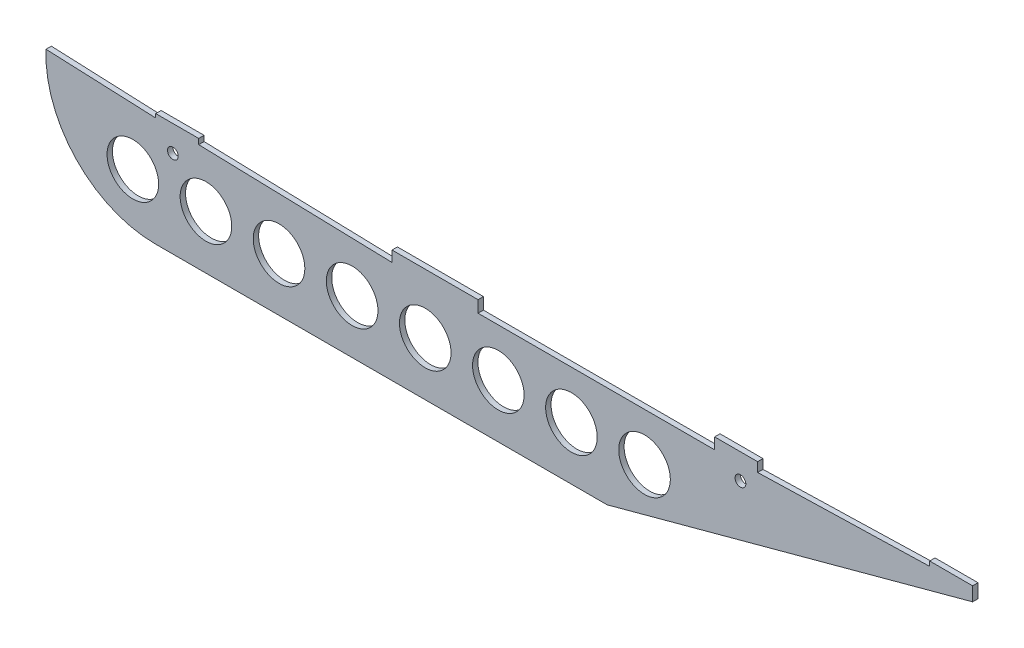
ISO-10303-21;
HEADER;
FILE_DESCRIPTION(('STEP AP214'),'2;1');
FILE_NAME('part.step','',(''),(''),'','','');
FILE_SCHEMA(('AUTOMOTIVE_DESIGN { 1 0 10303 214 1 1 1 1 }'));
ENDSEC;
DATA;
#1=APPLICATION_CONTEXT('core data for automotive mechanical design processes');
#2=APPLICATION_PROTOCOL_DEFINITION('international standard','automotive_design',2000,#1);
#3=PRODUCT_CONTEXT('',#1,'mechanical');
#4=PRODUCT('Part','Part','',(#3));
#5=PRODUCT_RELATED_PRODUCT_CATEGORY('part','',(#4));
#6=PRODUCT_DEFINITION_FORMATION('','',#4);
#7=PRODUCT_DEFINITION_CONTEXT('part definition',#1,'design');
#8=PRODUCT_DEFINITION('design','',#6,#7);
#9=PRODUCT_DEFINITION_SHAPE('','',#8);
#10=(LENGTH_UNIT() NAMED_UNIT(*) SI_UNIT(.MILLI.,.METRE.));
#11=(NAMED_UNIT(*) PLANE_ANGLE_UNIT() SI_UNIT($,.RADIAN.));
#12=(NAMED_UNIT(*) SI_UNIT($,.STERADIAN.) SOLID_ANGLE_UNIT());
#13=UNCERTAINTY_MEASURE_WITH_UNIT(LENGTH_MEASURE(1.E-05),#10,'distance_accuracy_value','');
#14=(GEOMETRIC_REPRESENTATION_CONTEXT(3) GLOBAL_UNCERTAINTY_ASSIGNED_CONTEXT((#13)) GLOBAL_UNIT_ASSIGNED_CONTEXT((#10,
#11,#12)) REPRESENTATION_CONTEXT('',''));
#15=CARTESIAN_POINT('',(0.,0.,0.));
#16=DIRECTION('',(0.,0.,1.));
#17=DIRECTION('',(1.,0.,0.));
#18=AXIS2_PLACEMENT_3D('',#15,#16,#17);
#19=CARTESIAN_POINT('',(64.5101689248782,-2.758684602,-1.5875));
#20=DIRECTION('',(0.,0.,1.));
#21=DIRECTION('',(1.,0.,0.));
#22=AXIS2_PLACEMENT_3D('',#19,#20,#21);
#23=PLANE('',#22);
#24=CARTESIAN_POINT('',(267.202840923619,-35.7108845805905,-1.5875));
#25=DIRECTION('',(0.,0.,1.));
#26=DIRECTION('',(1.,0.,0.));
#27=AXIS2_PLACEMENT_3D('',#24,#25,#26);
#28=CIRCLE('',#27,15.24);
#29=CARTESIAN_POINT('',(282.442840923619,-35.7108845805905,-1.5875));
#30=VERTEX_POINT('',#29);
#31=EDGE_CURVE('E366',#30,#30,#28,.F.);
#32=ORIENTED_EDGE('',*,*,#31,.F.);
#33=EDGE_LOOP('',(#32));
#34=FACE_BOUND('',#33,.T.);
#35=CARTESIAN_POINT('',(180.842840923619,-35.7108845805905,-1.5875));
#36=DIRECTION('',(0.,0.,1.));
#37=DIRECTION('',(1.,0.,0.));
#38=AXIS2_PLACEMENT_3D('',#35,#36,#37);
#39=CIRCLE('',#38,15.24);
#40=CARTESIAN_POINT('',(196.082840923619,-35.7108845805905,-1.5875));
#41=VERTEX_POINT('',#40);
#42=EDGE_CURVE('E358',#41,#41,#39,.F.);
#43=ORIENTED_EDGE('',*,*,#42,.F.);
#44=EDGE_LOOP('',(#43));
#45=FACE_BOUND('',#44,.T.);
#46=CARTESIAN_POINT('',(51.3028409236194,-35.7108845805905,-1.5875));
#47=DIRECTION('',(0.,0.,1.));
#48=DIRECTION('',(1.,0.,0.));
#49=AXIS2_PLACEMENT_3D('',#46,#47,#48);
#50=CIRCLE('',#49,15.24);
#51=CARTESIAN_POINT('',(66.5428409236194,-35.7108845805905,-1.5875));
#52=VERTEX_POINT('',#51);
#53=EDGE_CURVE('E350',#52,#52,#50,.F.);
#54=ORIENTED_EDGE('',*,*,#53,.F.);
#55=EDGE_LOOP('',(#54));
#56=FACE_BOUND('',#55,.T.);
#57=CARTESIAN_POINT('',(94.4828409236194,-35.7108845805905,-1.5875));
#58=DIRECTION('',(0.,0.,1.));
#59=DIRECTION('',(1.,0.,0.));
#60=AXIS2_PLACEMENT_3D('',#57,#58,#59);
#61=CIRCLE('',#60,15.24);
#62=CARTESIAN_POINT('',(109.722840923619,-35.7108845805905,-1.5875));
#63=VERTEX_POINT('',#62);
#64=EDGE_CURVE('E345',#63,#63,#61,.F.);
#65=ORIENTED_EDGE('',*,*,#64,.F.);
#66=EDGE_LOOP('',(#65));
#67=FACE_BOUND('',#66,.T.);
#68=CARTESIAN_POINT('',(410.219240225869,-15.743629592313,-1.5875));
#69=DIRECTION('',(0.,0.,1.));
#70=DIRECTION('',(1.,0.,0.));
#71=AXIS2_PLACEMENT_3D('',#68,#69,#70);
#72=CIRCLE('',#71,3.17499999999997);
#73=CARTESIAN_POINT('',(413.394240225869,-15.743629592313,-1.5875));
#74=VERTEX_POINT('',#73);
#75=EDGE_CURVE('E209',#74,#74,#72,.T.);
#76=ORIENTED_EDGE('',*,*,#75,.T.);
#77=EDGE_LOOP('',(#76));
#78=FACE_BOUND('',#77,.T.);
#79=DIRECTION('',(0.,-1.,0.));
#80=VECTOR('',#79,1.);
#81=CARTESIAN_POINT('',(204.414080589869,-0.503629592313006,-1.5875));
#82=LINE('',#81,#80);
#83=CARTESIAN_POINT('',(204.414080589869,-0.503629592313006,-1.5875));
#84=VERTEX_POINT('',#83);
#85=CARTESIAN_POINT('',(204.414080589869,-6.87581217431301,-1.5875));
#86=VERTEX_POINT('',#85);
#87=EDGE_CURVE('E186',#84,#86,#82,.T.);
#88=ORIENTED_EDGE('',*,*,#87,.F.);
#89=DIRECTION('',(-1.,0.,0.));
#90=VECTOR('',#89,1.);
#91=CARTESIAN_POINT('',(255.214080589869,-0.503629592313006,-1.5875));
#92=LINE('',#91,#90);
#93=CARTESIAN_POINT('',(255.214080589869,-0.503629592313006,-1.5875));
#94=VERTEX_POINT('',#93);
#95=EDGE_CURVE('E191',#94,#84,#92,.T.);
#96=ORIENTED_EDGE('',*,*,#95,.F.);
#97=DIRECTION('',(0.,1.,0.));
#98=VECTOR('',#97,1.);
#99=CARTESIAN_POINT('',(255.214080589869,-7.43290250031301,-1.5875));
#100=LINE('',#99,#98);
#101=CARTESIAN_POINT('',(255.214080589869,-7.43290250031301,-1.5875));
#102=VERTEX_POINT('',#101);
#103=EDGE_CURVE('E307',#102,#94,#100,.T.);
#104=ORIENTED_EDGE('',*,*,#103,.F.);
#105=DIRECTION('',(-1.,0.,0.));
#106=VECTOR('',#105,1.);
#107=CARTESIAN_POINT('',(394.979240225869,-7.432902500313,-1.5875));
#108=LINE('',#107,#106);
#109=CARTESIAN_POINT('',(394.979240225869,-7.432902500313,-1.5875));
#110=VERTEX_POINT('',#109);
#111=EDGE_CURVE('E304',#110,#102,#108,.T.);
#112=ORIENTED_EDGE('',*,*,#111,.F.);
#113=DIRECTION('',(0.,-1.,0.));
#114=VECTOR('',#113,1.);
#115=CARTESIAN_POINT('',(394.979240225869,-0.803587590313005,-1.5875));
#116=LINE('',#115,#114);
#117=CARTESIAN_POINT('',(394.979240225869,-0.803587590313005,-1.5875));
#118=VERTEX_POINT('',#117);
#119=EDGE_CURVE('E301',#118,#110,#116,.T.);
#120=ORIENTED_EDGE('',*,*,#119,.F.);
#121=DIRECTION('',(-1.,0.,0.));
#122=VECTOR('',#121,1.);
#123=CARTESIAN_POINT('',(420.379240225869,-0.803587590313005,-1.5875));
#124=LINE('',#123,#122);
#125=CARTESIAN_POINT('',(420.379240225869,-0.803587590313005,-1.5875));
#126=VERTEX_POINT('',#125);
#127=EDGE_CURVE('E297',#126,#118,#124,.T.);
#128=ORIENTED_EDGE('',*,*,#127,.F.);
#129=DIRECTION('',(0.,1.,0.));
#130=VECTOR('',#129,1.);
#131=CARTESIAN_POINT('',(420.379240225869,-6.318039604313,-1.5875));
#132=LINE('',#131,#130);
#133=CARTESIAN_POINT('',(420.379240225869,-6.318039604313,-1.5875));
#134=VERTEX_POINT('',#133);
#135=EDGE_CURVE('E294',#134,#126,#132,.T.);
#136=ORIENTED_EDGE('',*,*,#135,.F.);
#137=DIRECTION('',(-0.999629163258681,-0.0272311579399124,0.));
#138=VECTOR('',#137,1.);
#139=CARTESIAN_POINT('',(521.979240225869,-3.55032758831298,-1.5875));
#140=LINE('',#139,#138);
#141=CARTESIAN_POINT('',(521.979240225869,-3.55032758831298,-1.5875));
#142=VERTEX_POINT('',#141);
#143=EDGE_CURVE('E291',#142,#134,#140,.T.);
#144=ORIENTED_EDGE('',*,*,#143,.F.);
#145=DIRECTION('',(0.,-1.,0.));
#146=VECTOR('',#145,1.);
#147=CARTESIAN_POINT('',(521.979240225869,-0.803587590312984,-1.5875));
#148=LINE('',#147,#146);
#149=CARTESIAN_POINT('',(521.979240225869,-0.803587590312984,-1.5875));
#150=VERTEX_POINT('',#149);
#151=EDGE_CURVE('E288',#150,#142,#148,.T.);
#152=ORIENTED_EDGE('',*,*,#151,.F.);
#153=DIRECTION('',(-1.,0.,0.));
#154=VECTOR('',#153,1.);
#155=CARTESIAN_POINT('',(547.379240225869,-0.803587590312981,-1.5875));
#156=LINE('',#155,#154);
#157=CARTESIAN_POINT('',(547.379240225869,-0.803587590312981,-1.5875));
#158=VERTEX_POINT('',#157);
#159=EDGE_CURVE('E285',#158,#150,#156,.T.);
#160=ORIENTED_EDGE('',*,*,#159,.F.);
#161=DIRECTION('',(0.,-1.,0.));
#162=VECTOR('',#161,1.);
#163=CARTESIAN_POINT('',(547.379240225869,-0.803587590312981,-1.5875));
#164=LINE('',#163,#162);
#165=CARTESIAN_POINT('',(547.379240225869,-9.01553003168141,-1.5875));
#166=VERTEX_POINT('',#165);
#167=EDGE_CURVE('E283',#158,#166,#164,.T.);
#168=ORIENTED_EDGE('',*,*,#167,.T.);
#169=DIRECTION('',(0.965407381309722,0.260746213994959,0.));
#170=VECTOR('',#169,1.);
#171=CARTESIAN_POINT('',(331.479240225869,-67.3278121743131,-1.5875));
#172=LINE('',#171,#170);
#173=CARTESIAN_POINT('',(331.479240225869,-67.3278121743131,-1.5875));
#174=VERTEX_POINT('',#173);
#175=EDGE_CURVE('E280',#174,#166,#172,.T.);
#176=ORIENTED_EDGE('',*,*,#175,.F.);
#177=DIRECTION('',(-1.,0.,0.));
#178=VECTOR('',#177,1.);
#179=CARTESIAN_POINT('',(331.479240225869,-67.3278121743131,-1.5875));
#180=LINE('',#179,#178);
#181=CARTESIAN_POINT('',(64.5101689248782,-67.327812174313,-1.5875));
#182=VERTEX_POINT('',#181);
#183=EDGE_CURVE('E278',#174,#182,#180,.T.);
#184=ORIENTED_EDGE('',*,*,#183,.T.);
#185=CARTESIAN_POINT('',(64.5101689248782,-2.758684602,-1.5875));
#186=DIRECTION('',(0.,0.,1.));
#187=DIRECTION('',(1.,0.,0.));
#188=AXIS2_PLACEMENT_3D('',#185,#186,#187);
#189=CIRCLE('',#188,64.569127572313);
#190=CARTESIAN_POINT('',(0.,0.,-1.5875));
#191=VERTEX_POINT('',#190);
#192=EDGE_CURVE('E275',#191,#182,#189,.T.);
#193=ORIENTED_EDGE('',*,*,#192,.F.);
#194=DIRECTION('',(-0.999086891063089,0.0427245141094792,0.));
#195=VECTOR('',#194,1.);
#196=CARTESIAN_POINT('',(64.8231917349118,-2.77207057231304,-1.5875));
#197=LINE('',#196,#195);
#198=CARTESIAN_POINT('',(64.8231917349118,-2.77207057231304,-1.5875));
#199=VERTEX_POINT('',#198);
#200=EDGE_CURVE('E272',#199,#191,#197,.T.);
#201=ORIENTED_EDGE('',*,*,#200,.F.);
#202=DIRECTION('',(0.,-1.,0.));
#203=VECTOR('',#202,1.);
#204=CARTESIAN_POINT('',(64.8231917349118,-0.503629592313044,-1.5875));
#205=LINE('',#204,#203);
#206=CARTESIAN_POINT('',(64.8231917349118,-0.503629592313044,-1.5875));
#207=VERTEX_POINT('',#206);
#208=EDGE_CURVE('E269',#207,#199,#205,.T.);
#209=ORIENTED_EDGE('',*,*,#208,.F.);
#210=DIRECTION('',(-1.,0.,0.));
#211=VECTOR('',#210,1.);
#212=CARTESIAN_POINT('',(90.2231917349118,-0.503629592313039,-1.5875));
#213=LINE('',#212,#211);
#214=CARTESIAN_POINT('',(90.2231917349118,-0.503629592313039,-1.5875));
#215=VERTEX_POINT('',#214);
#216=EDGE_CURVE('E266',#215,#207,#213,.T.);
#217=ORIENTED_EDGE('',*,*,#216,.F.);
#218=DIRECTION('',(0.,1.,0.));
#219=VECTOR('',#218,1.);
#220=CARTESIAN_POINT('',(90.2231917349118,-3.70727063231304,-1.5875));
#221=LINE('',#220,#219);
#222=CARTESIAN_POINT('',(90.2231917349118,-3.70727063231304,-1.5875));
#223=VERTEX_POINT('',#222);
#224=EDGE_CURVE('E263',#223,#215,#221,.T.);
#225=ORIENTED_EDGE('',*,*,#224,.F.);
#226=DIRECTION('',(-0.999615253026986,0.0277370855677976,0.));
#227=VECTOR('',#226,1.);
#228=CARTESIAN_POINT('',(204.414080589869,-6.87581217431301,-1.5875));
#229=LINE('',#228,#227);
#230=EDGE_CURVE('E261',#86,#223,#229,.T.);
#231=ORIENTED_EDGE('',*,*,#230,.F.);
#232=EDGE_LOOP('',(#88,#96,#104,#112,#120,#128,#136,#144,#152,#160,#168,#176,#184,#193,#201,
#209,#217,#225,#231));
#233=FACE_BOUND('',#232,.T.);
#234=CARTESIAN_POINT('',(74.939240225869,-15.743629592313,-1.5875));
#235=DIRECTION('',(0.,0.,1.));
#236=DIRECTION('',(1.,0.,0.));
#237=AXIS2_PLACEMENT_3D('',#234,#235,#236);
#238=CIRCLE('',#237,3.175);
#239=CARTESIAN_POINT('',(78.114240225869,-15.743629592313,-1.5875));
#240=VERTEX_POINT('',#239);
#241=EDGE_CURVE('E395',#240,#240,#238,.T.);
#242=ORIENTED_EDGE('',*,*,#241,.T.);
#243=EDGE_LOOP('',(#242));
#244=FACE_BOUND('',#243,.T.);
#245=CARTESIAN_POINT('',(353.562840923619,-35.7108845805904,-1.5875));
#246=DIRECTION('',(0.,0.,1.));
#247=DIRECTION('',(1.,0.,0.));
#248=AXIS2_PLACEMENT_3D('',#245,#246,#247);
#249=CIRCLE('',#248,15.24);
#250=CARTESIAN_POINT('',(368.802840923619,-35.7108845805904,-1.5875));
#251=VERTEX_POINT('',#250);
#252=EDGE_CURVE('E346',#251,#251,#249,.F.);
#253=ORIENTED_EDGE('',*,*,#252,.F.);
#254=EDGE_LOOP('',(#253));
#255=FACE_BOUND('',#254,.T.);
#256=CARTESIAN_POINT('',(137.662840923619,-35.7108845805905,-1.5875));
#257=DIRECTION('',(0.,0.,1.));
#258=DIRECTION('',(1.,0.,0.));
#259=AXIS2_PLACEMENT_3D('',#256,#257,#258);
#260=CIRCLE('',#259,15.24);
#261=CARTESIAN_POINT('',(152.902840923619,-35.7108845805905,-1.5875));
#262=VERTEX_POINT('',#261);
#263=EDGE_CURVE('E354',#262,#262,#260,.F.);
#264=ORIENTED_EDGE('',*,*,#263,.F.);
#265=EDGE_LOOP('',(#264));
#266=FACE_BOUND('',#265,.T.);
#267=CARTESIAN_POINT('',(224.022840923619,-35.7108845805905,-1.5875));
#268=DIRECTION('',(0.,0.,1.));
#269=DIRECTION('',(1.,0.,0.));
#270=AXIS2_PLACEMENT_3D('',#267,#268,#269);
#271=CIRCLE('',#270,15.24);
#272=CARTESIAN_POINT('',(239.262840923619,-35.7108845805905,-1.5875));
#273=VERTEX_POINT('',#272);
#274=EDGE_CURVE('E363',#273,#273,#271,.F.);
#275=ORIENTED_EDGE('',*,*,#274,.F.);
#276=EDGE_LOOP('',(#275));
#277=FACE_BOUND('',#276,.T.);
#278=CARTESIAN_POINT('',(310.382840923619,-35.7108845805905,-1.5875));
#279=DIRECTION('',(0.,0.,1.));
#280=DIRECTION('',(1.,0.,0.));
#281=AXIS2_PLACEMENT_3D('',#278,#279,#280);
#282=CIRCLE('',#281,15.24);
#283=CARTESIAN_POINT('',(325.622840923619,-35.7108845805905,-1.5875));
#284=VERTEX_POINT('',#283);
#285=EDGE_CURVE('E369',#284,#284,#282,.F.);
#286=ORIENTED_EDGE('',*,*,#285,.F.);
#287=EDGE_LOOP('',(#286));
#288=FACE_BOUND('',#287,.T.);
#289=ADVANCED_FACE('F53',(#34,#45,#56,#67,#78,#233,#244,#255,#266,#277,#288),#23,.F.);
#290=CARTESIAN_POINT('',(64.5101689248782,-2.758684602,1.5875));
#291=DIRECTION('',(0.,0.,1.));
#292=DIRECTION('',(1.,0.,0.));
#293=AXIS2_PLACEMENT_3D('',#290,#291,#292);
#294=PLANE('',#293);
#295=CARTESIAN_POINT('',(267.202840923619,-35.7108845805905,1.5875));
#296=DIRECTION('',(0.,0.,1.));
#297=DIRECTION('',(1.,0.,0.));
#298=AXIS2_PLACEMENT_3D('',#295,#296,#297);
#299=CIRCLE('',#298,15.24);
#300=CARTESIAN_POINT('',(282.442840923619,-35.7108845805905,1.5875));
#301=VERTEX_POINT('',#300);
#302=EDGE_CURVE('E367',#301,#301,#299,.F.);
#303=ORIENTED_EDGE('',*,*,#302,.T.);
#304=EDGE_LOOP('',(#303));
#305=FACE_BOUND('',#304,.T.);
#306=CARTESIAN_POINT('',(180.842840923619,-35.7108845805905,1.5875));
#307=DIRECTION('',(0.,0.,1.));
#308=DIRECTION('',(1.,0.,0.));
#309=AXIS2_PLACEMENT_3D('',#306,#307,#308);
#310=CIRCLE('',#309,15.24);
#311=CARTESIAN_POINT('',(196.082840923619,-35.7108845805905,1.5875));
#312=VERTEX_POINT('',#311);
#313=EDGE_CURVE('E359',#312,#312,#310,.F.);
#314=ORIENTED_EDGE('',*,*,#313,.T.);
#315=EDGE_LOOP('',(#314));
#316=FACE_BOUND('',#315,.T.);
#317=CARTESIAN_POINT('',(51.3028409236194,-35.7108845805905,1.5875));
#318=DIRECTION('',(0.,0.,1.));
#319=DIRECTION('',(1.,0.,0.));
#320=AXIS2_PLACEMENT_3D('',#317,#318,#319);
#321=CIRCLE('',#320,15.24);
#322=CARTESIAN_POINT('',(66.5428409236194,-35.7108845805905,1.5875));
#323=VERTEX_POINT('',#322);
#324=EDGE_CURVE('E351',#323,#323,#321,.F.);
#325=ORIENTED_EDGE('',*,*,#324,.T.);
#326=EDGE_LOOP('',(#325));
#327=FACE_BOUND('',#326,.T.);
#328=CARTESIAN_POINT('',(94.4828409236194,-35.7108845805905,1.5875));
#329=DIRECTION('',(0.,0.,1.));
#330=DIRECTION('',(1.,0.,0.));
#331=AXIS2_PLACEMENT_3D('',#328,#329,#330);
#332=CIRCLE('',#331,15.24);
#333=CARTESIAN_POINT('',(109.722840923619,-35.7108845805905,1.5875));
#334=VERTEX_POINT('',#333);
#335=EDGE_CURVE('E342',#334,#334,#332,.F.);
#336=ORIENTED_EDGE('',*,*,#335,.T.);
#337=EDGE_LOOP('',(#336));
#338=FACE_BOUND('',#337,.T.);
#339=CARTESIAN_POINT('',(410.219240225869,-15.743629592313,1.5875));
#340=DIRECTION('',(0.,0.,1.));
#341=DIRECTION('',(1.,0.,0.));
#342=AXIS2_PLACEMENT_3D('',#339,#340,#341);
#343=CIRCLE('',#342,3.17499999999997);
#344=CARTESIAN_POINT('',(413.394240225869,-15.743629592313,1.5875));
#345=VERTEX_POINT('',#344);
#346=EDGE_CURVE('E206',#345,#345,#343,.T.);
#347=ORIENTED_EDGE('',*,*,#346,.F.);
#348=EDGE_LOOP('',(#347));
#349=FACE_BOUND('',#348,.T.);
#350=DIRECTION('',(0.,-1.,0.));
#351=VECTOR('',#350,1.);
#352=CARTESIAN_POINT('',(204.414080589869,-0.503629592313006,1.5875));
#353=LINE('',#352,#351);
#354=CARTESIAN_POINT('',(204.414080589869,-0.503629592313006,1.5875));
#355=VERTEX_POINT('',#354);
#356=CARTESIAN_POINT('',(204.414080589869,-6.87581217431301,1.5875));
#357=VERTEX_POINT('',#356);
#358=EDGE_CURVE('E185',#355,#357,#353,.T.);
#359=ORIENTED_EDGE('',*,*,#358,.T.);
#360=DIRECTION('',(-0.999615253026986,0.0277370855677976,0.));
#361=VECTOR('',#360,1.);
#362=CARTESIAN_POINT('',(204.414080589869,-6.87581217431301,1.5875));
#363=LINE('',#362,#361);
#364=CARTESIAN_POINT('',(90.2231917349118,-3.70727063231304,1.5875));
#365=VERTEX_POINT('',#364);
#366=EDGE_CURVE('E194',#357,#365,#363,.T.);
#367=ORIENTED_EDGE('',*,*,#366,.T.);
#368=DIRECTION('',(0.,1.,0.));
#369=VECTOR('',#368,1.);
#370=CARTESIAN_POINT('',(90.2231917349118,-3.70727063231304,1.5875));
#371=LINE('',#370,#369);
#372=CARTESIAN_POINT('',(90.2231917349118,-0.503629592313039,1.5875));
#373=VERTEX_POINT('',#372);
#374=EDGE_CURVE('E199',#365,#373,#371,.T.);
#375=ORIENTED_EDGE('',*,*,#374,.T.);
#376=DIRECTION('',(-1.,0.,0.));
#377=VECTOR('',#376,1.);
#378=CARTESIAN_POINT('',(90.2231917349118,-0.503629592313039,1.5875));
#379=LINE('',#378,#377);
#380=CARTESIAN_POINT('',(64.8231917349118,-0.503629592313044,1.5875));
#381=VERTEX_POINT('',#380);
#382=EDGE_CURVE('E214',#373,#381,#379,.T.);
#383=ORIENTED_EDGE('',*,*,#382,.T.);
#384=DIRECTION('',(0.,-1.,0.));
#385=VECTOR('',#384,1.);
#386=CARTESIAN_POINT('',(64.8231917349118,-0.503629592313044,1.5875));
#387=LINE('',#386,#385);
#388=CARTESIAN_POINT('',(64.8231917349118,-2.77207057231304,1.5875));
#389=VERTEX_POINT('',#388);
#390=EDGE_CURVE('E217',#381,#389,#387,.T.);
#391=ORIENTED_EDGE('',*,*,#390,.T.);
#392=DIRECTION('',(-0.999086891063089,0.0427245141094792,0.));
#393=VECTOR('',#392,1.);
#394=CARTESIAN_POINT('',(64.8231917349118,-2.77207057231304,1.5875));
#395=LINE('',#394,#393);
#396=CARTESIAN_POINT('',(0.,0.,1.5875));
#397=VERTEX_POINT('',#396);
#398=EDGE_CURVE('E220',#389,#397,#395,.T.);
#399=ORIENTED_EDGE('',*,*,#398,.T.);
#400=CARTESIAN_POINT('',(64.5101689248782,-2.758684602,1.5875));
#401=DIRECTION('',(0.,0.,1.));
#402=DIRECTION('',(1.,0.,0.));
#403=AXIS2_PLACEMENT_3D('',#400,#401,#402);
#404=CIRCLE('',#403,64.569127572313);
#405=CARTESIAN_POINT('',(64.5101689248782,-67.327812174313,1.5875));
#406=VERTEX_POINT('',#405);
#407=EDGE_CURVE('E223',#397,#406,#404,.T.);
#408=ORIENTED_EDGE('',*,*,#407,.T.);
#409=DIRECTION('',(-1.,0.,0.));
#410=VECTOR('',#409,1.);
#411=CARTESIAN_POINT('',(331.479240225869,-67.3278121743131,1.5875));
#412=LINE('',#411,#410);
#413=CARTESIAN_POINT('',(331.479240225869,-67.3278121743131,1.5875));
#414=VERTEX_POINT('',#413);
#415=EDGE_CURVE('E226',#414,#406,#412,.T.);
#416=ORIENTED_EDGE('',*,*,#415,.F.);
#417=DIRECTION('',(0.965407381309722,0.260746213994959,0.));
#418=VECTOR('',#417,1.);
#419=CARTESIAN_POINT('',(331.479240225869,-67.3278121743131,1.5875));
#420=LINE('',#419,#418);
#421=CARTESIAN_POINT('',(547.379240225869,-9.01553003168141,1.5875));
#422=VERTEX_POINT('',#421);
#423=EDGE_CURVE('E229',#414,#422,#420,.T.);
#424=ORIENTED_EDGE('',*,*,#423,.T.);
#425=DIRECTION('',(0.,-1.,0.));
#426=VECTOR('',#425,1.);
#427=CARTESIAN_POINT('',(547.379240225869,-0.803587590312981,1.5875));
#428=LINE('',#427,#426);
#429=CARTESIAN_POINT('',(547.379240225869,-0.803587590312981,1.5875));
#430=VERTEX_POINT('',#429);
#431=EDGE_CURVE('E232',#430,#422,#428,.T.);
#432=ORIENTED_EDGE('',*,*,#431,.F.);
#433=DIRECTION('',(-1.,0.,0.));
#434=VECTOR('',#433,1.);
#435=CARTESIAN_POINT('',(547.379240225869,-0.803587590312981,1.5875));
#436=LINE('',#435,#434);
#437=CARTESIAN_POINT('',(521.979240225869,-0.803587590312984,1.5875));
#438=VERTEX_POINT('',#437);
#439=EDGE_CURVE('E235',#430,#438,#436,.T.);
#440=ORIENTED_EDGE('',*,*,#439,.T.);
#441=DIRECTION('',(0.,-1.,0.));
#442=VECTOR('',#441,1.);
#443=CARTESIAN_POINT('',(521.979240225869,-0.803587590312984,1.5875));
#444=LINE('',#443,#442);
#445=CARTESIAN_POINT('',(521.979240225869,-3.55032758831298,1.5875));
#446=VERTEX_POINT('',#445);
#447=EDGE_CURVE('E238',#438,#446,#444,.T.);
#448=ORIENTED_EDGE('',*,*,#447,.T.);
#449=DIRECTION('',(-0.999629163258681,-0.0272311579399124,0.));
#450=VECTOR('',#449,1.);
#451=CARTESIAN_POINT('',(521.979240225869,-3.55032758831298,1.5875));
#452=LINE('',#451,#450);
#453=CARTESIAN_POINT('',(420.379240225869,-6.318039604313,1.5875));
#454=VERTEX_POINT('',#453);
#455=EDGE_CURVE('E241',#446,#454,#452,.T.);
#456=ORIENTED_EDGE('',*,*,#455,.T.);
#457=DIRECTION('',(0.,1.,0.));
#458=VECTOR('',#457,1.);
#459=CARTESIAN_POINT('',(420.379240225869,-6.318039604313,1.5875));
#460=LINE('',#459,#458);
#461=CARTESIAN_POINT('',(420.379240225869,-0.803587590313005,1.5875));
#462=VERTEX_POINT('',#461);
#463=EDGE_CURVE('E244',#454,#462,#460,.T.);
#464=ORIENTED_EDGE('',*,*,#463,.T.);
#465=DIRECTION('',(-1.,0.,0.));
#466=VECTOR('',#465,1.);
#467=CARTESIAN_POINT('',(420.379240225869,-0.803587590313005,1.5875));
#468=LINE('',#467,#466);
#469=CARTESIAN_POINT('',(394.979240225869,-0.803587590313005,1.5875));
#470=VERTEX_POINT('',#469);
#471=EDGE_CURVE('E247',#462,#470,#468,.T.);
#472=ORIENTED_EDGE('',*,*,#471,.T.);
#473=DIRECTION('',(0.,-1.,0.));
#474=VECTOR('',#473,1.);
#475=CARTESIAN_POINT('',(394.979240225869,-0.803587590313005,1.5875));
#476=LINE('',#475,#474);
#477=CARTESIAN_POINT('',(394.979240225869,-7.432902500313,1.5875));
#478=VERTEX_POINT('',#477);
#479=EDGE_CURVE('E251',#470,#478,#476,.T.);
#480=ORIENTED_EDGE('',*,*,#479,.T.);
#481=DIRECTION('',(-1.,0.,0.));
#482=VECTOR('',#481,1.);
#483=CARTESIAN_POINT('',(394.979240225869,-7.432902500313,1.5875));
#484=LINE('',#483,#482);
#485=CARTESIAN_POINT('',(255.214080589869,-7.43290250031301,1.5875));
#486=VERTEX_POINT('',#485);
#487=EDGE_CURVE('E254',#478,#486,#484,.T.);
#488=ORIENTED_EDGE('',*,*,#487,.T.);
#489=DIRECTION('',(0.,1.,0.));
#490=VECTOR('',#489,1.);
#491=CARTESIAN_POINT('',(255.214080589869,-7.43290250031301,1.5875));
#492=LINE('',#491,#490);
#493=CARTESIAN_POINT('',(255.214080589869,-0.503629592313006,1.5875));
#494=VERTEX_POINT('',#493);
#495=EDGE_CURVE('E257',#486,#494,#492,.T.);
#496=ORIENTED_EDGE('',*,*,#495,.T.);
#497=DIRECTION('',(-1.,0.,0.));
#498=VECTOR('',#497,1.);
#499=CARTESIAN_POINT('',(255.214080589869,-0.503629592313006,1.5875));
#500=LINE('',#499,#498);
#501=EDGE_CURVE('E205',#494,#355,#500,.T.);
#502=ORIENTED_EDGE('',*,*,#501,.T.);
#503=EDGE_LOOP('',(#359,#367,#375,#383,#391,#399,#408,#416,#424,#432,#440,#448,#456,#464,#472,
#480,#488,#496,#502));
#504=FACE_BOUND('',#503,.T.);
#505=CARTESIAN_POINT('',(74.939240225869,-15.743629592313,1.5875));
#506=DIRECTION('',(0.,0.,1.));
#507=DIRECTION('',(1.,0.,0.));
#508=AXIS2_PLACEMENT_3D('',#505,#506,#507);
#509=CIRCLE('',#508,3.175);
#510=CARTESIAN_POINT('',(78.114240225869,-15.743629592313,1.5875));
#511=VERTEX_POINT('',#510);
#512=EDGE_CURVE('E392',#511,#511,#509,.T.);
#513=ORIENTED_EDGE('',*,*,#512,.F.);
#514=EDGE_LOOP('',(#513));
#515=FACE_BOUND('',#514,.T.);
#516=CARTESIAN_POINT('',(353.562840923619,-35.7108845805904,1.5875));
#517=DIRECTION('',(0.,0.,1.));
#518=DIRECTION('',(1.,0.,0.));
#519=AXIS2_PLACEMENT_3D('',#516,#517,#518);
#520=CIRCLE('',#519,15.24);
#521=CARTESIAN_POINT('',(368.802840923619,-35.7108845805904,1.5875));
#522=VERTEX_POINT('',#521);
#523=EDGE_CURVE('E347',#522,#522,#520,.F.);
#524=ORIENTED_EDGE('',*,*,#523,.T.);
#525=EDGE_LOOP('',(#524));
#526=FACE_BOUND('',#525,.T.);
#527=CARTESIAN_POINT('',(137.662840923619,-35.7108845805905,1.5875));
#528=DIRECTION('',(0.,0.,1.));
#529=DIRECTION('',(1.,0.,0.));
#530=AXIS2_PLACEMENT_3D('',#527,#528,#529);
#531=CIRCLE('',#530,15.24);
#532=CARTESIAN_POINT('',(152.902840923619,-35.7108845805905,1.5875));
#533=VERTEX_POINT('',#532);
#534=EDGE_CURVE('E355',#533,#533,#531,.F.);
#535=ORIENTED_EDGE('',*,*,#534,.T.);
#536=EDGE_LOOP('',(#535));
#537=FACE_BOUND('',#536,.T.);
#538=CARTESIAN_POINT('',(224.022840923619,-35.7108845805905,1.5875));
#539=DIRECTION('',(0.,0.,1.));
#540=DIRECTION('',(1.,0.,0.));
#541=AXIS2_PLACEMENT_3D('',#538,#539,#540);
#542=CIRCLE('',#541,15.24);
#543=CARTESIAN_POINT('',(239.262840923619,-35.7108845805905,1.5875));
#544=VERTEX_POINT('',#543);
#545=EDGE_CURVE('E364',#544,#544,#542,.F.);
#546=ORIENTED_EDGE('',*,*,#545,.T.);
#547=EDGE_LOOP('',(#546));
#548=FACE_BOUND('',#547,.T.);
#549=CARTESIAN_POINT('',(310.382840923619,-35.7108845805905,1.5875));
#550=DIRECTION('',(0.,0.,1.));
#551=DIRECTION('',(1.,0.,0.));
#552=AXIS2_PLACEMENT_3D('',#549,#550,#551);
#553=CIRCLE('',#552,15.24);
#554=CARTESIAN_POINT('',(325.622840923619,-35.7108845805905,1.5875));
#555=VERTEX_POINT('',#554);
#556=EDGE_CURVE('E57',#555,#555,#553,.F.);
#557=ORIENTED_EDGE('',*,*,#556,.T.);
#558=EDGE_LOOP('',(#557));
#559=FACE_BOUND('',#558,.T.);
#560=ADVANCED_FACE('F202',(#305,#316,#327,#338,#349,#504,#515,#526,#537,#548,#559),#294,.T.);
#561=CARTESIAN_POINT('',(204.414080589869,-0.503629592313006,-1.5875));
#562=DIRECTION('',(-1.,0.,0.));
#563=DIRECTION('',(0.,-1.,0.));
#564=AXIS2_PLACEMENT_3D('',#561,#562,#563);
#565=PLANE('',#564);
#566=DIRECTION('',(0.,0.,1.));
#567=VECTOR('',#566,1.);
#568=CARTESIAN_POINT('',(204.414080589869,-6.87581217431301,-1.5875));
#569=LINE('',#568,#567);
#570=EDGE_CURVE('E182',#86,#357,#569,.T.);
#571=ORIENTED_EDGE('',*,*,#570,.T.);
#572=ORIENTED_EDGE('',*,*,#358,.F.);
#573=DIRECTION('',(0.,0.,1.));
#574=VECTOR('',#573,1.);
#575=CARTESIAN_POINT('',(204.414080589869,-0.503629592313006,-1.5875));
#576=LINE('',#575,#574);
#577=EDGE_CURVE('E12',#84,#355,#576,.T.);
#578=ORIENTED_EDGE('',*,*,#577,.F.);
#579=ORIENTED_EDGE('',*,*,#87,.T.);
#580=EDGE_LOOP('',(#571,#572,#578,#579));
#581=FACE_BOUND('',#580,.T.);
#582=ADVANCED_FACE('F55',(#581),#565,.T.);
#583=CARTESIAN_POINT('',(255.214080589869,-0.503629592313006,-1.5875));
#584=DIRECTION('',(0.,1.,0.));
#585=DIRECTION('',(0.,0.,1.));
#586=AXIS2_PLACEMENT_3D('',#583,#584,#585);
#587=PLANE('',#586);
#588=ORIENTED_EDGE('',*,*,#577,.T.);
#589=ORIENTED_EDGE('',*,*,#501,.F.);
#590=DIRECTION('',(0.,0.,1.));
#591=VECTOR('',#590,1.);
#592=CARTESIAN_POINT('',(255.214080589869,-0.503629592313006,-1.5875));
#593=LINE('',#592,#591);
#594=EDGE_CURVE('E62',#94,#494,#593,.T.);
#595=ORIENTED_EDGE('',*,*,#594,.F.);
#596=ORIENTED_EDGE('',*,*,#95,.T.);
#597=EDGE_LOOP('',(#588,#589,#595,#596));
#598=FACE_BOUND('',#597,.T.);
#599=ADVANCED_FACE('F425',(#598),#587,.T.);
#600=CARTESIAN_POINT('',(255.214080589869,-7.43290250031301,-1.5875));
#601=DIRECTION('',(1.,0.,0.));
#602=DIRECTION('',(0.,0.,-1.));
#603=AXIS2_PLACEMENT_3D('',#600,#601,#602);
#604=PLANE('',#603);
#605=ORIENTED_EDGE('',*,*,#594,.T.);
#606=ORIENTED_EDGE('',*,*,#495,.F.);
#607=DIRECTION('',(0.,0.,1.));
#608=VECTOR('',#607,1.);
#609=CARTESIAN_POINT('',(255.214080589869,-7.43290250031301,-1.5875));
#610=LINE('',#609,#608);
#611=EDGE_CURVE('E311',#102,#486,#610,.T.);
#612=ORIENTED_EDGE('',*,*,#611,.F.);
#613=ORIENTED_EDGE('',*,*,#103,.T.);
#614=EDGE_LOOP('',(#605,#606,#612,#613));
#615=FACE_BOUND('',#614,.T.);
#616=ADVANCED_FACE('F428',(#615),#604,.T.);
#617=CARTESIAN_POINT('',(394.979240225869,-7.432902500313,-1.5875));
#618=DIRECTION('',(0.,1.,0.));
#619=DIRECTION('',(-1.,0.,0.));
#620=AXIS2_PLACEMENT_3D('',#617,#618,#619);
#621=PLANE('',#620);
#622=ORIENTED_EDGE('',*,*,#611,.T.);
#623=ORIENTED_EDGE('',*,*,#487,.F.);
#624=DIRECTION('',(0.,0.,1.));
#625=VECTOR('',#624,1.);
#626=CARTESIAN_POINT('',(394.979240225869,-7.432902500313,-1.5875));
#627=LINE('',#626,#625);
#628=EDGE_CURVE('E313',#110,#478,#627,.T.);
#629=ORIENTED_EDGE('',*,*,#628,.F.);
#630=ORIENTED_EDGE('',*,*,#111,.T.);
#631=EDGE_LOOP('',(#622,#623,#629,#630));
#632=FACE_BOUND('',#631,.T.);
#633=ADVANCED_FACE('F431',(#632),#621,.T.);
#634=CARTESIAN_POINT('',(394.979240225869,-0.803587590313005,-1.5875));
#635=DIRECTION('',(-1.,0.,0.));
#636=DIRECTION('',(0.,0.,1.));
#637=AXIS2_PLACEMENT_3D('',#634,#635,#636);
#638=PLANE('',#637);
#639=ORIENTED_EDGE('',*,*,#628,.T.);
#640=ORIENTED_EDGE('',*,*,#479,.F.);
#641=DIRECTION('',(0.,0.,1.));
#642=VECTOR('',#641,1.);
#643=CARTESIAN_POINT('',(394.979240225869,-0.803587590313005,-1.5875));
#644=LINE('',#643,#642);
#645=EDGE_CURVE('E315',#118,#470,#644,.T.);
#646=ORIENTED_EDGE('',*,*,#645,.F.);
#647=ORIENTED_EDGE('',*,*,#119,.T.);
#648=EDGE_LOOP('',(#639,#640,#646,#647));
#649=FACE_BOUND('',#648,.T.);
#650=ADVANCED_FACE('F435',(#649),#638,.T.);
#651=CARTESIAN_POINT('',(420.379240225869,-0.803587590313005,-1.5875));
#652=DIRECTION('',(0.,1.,0.));
#653=DIRECTION('',(0.,0.,1.));
#654=AXIS2_PLACEMENT_3D('',#651,#652,#653);
#655=PLANE('',#654);
#656=ORIENTED_EDGE('',*,*,#645,.T.);
#657=ORIENTED_EDGE('',*,*,#471,.F.);
#658=DIRECTION('',(0.,0.,1.));
#659=VECTOR('',#658,1.);
#660=CARTESIAN_POINT('',(420.379240225869,-0.803587590313005,-1.5875));
#661=LINE('',#660,#659);
#662=EDGE_CURVE('E317',#126,#462,#661,.T.);
#663=ORIENTED_EDGE('',*,*,#662,.F.);
#664=ORIENTED_EDGE('',*,*,#127,.T.);
#665=EDGE_LOOP('',(#656,#657,#663,#664));
#666=FACE_BOUND('',#665,.T.);
#667=ADVANCED_FACE('F439',(#666),#655,.T.);
#668=CARTESIAN_POINT('',(420.379240225869,-6.318039604313,-1.5875));
#669=DIRECTION('',(1.,0.,0.));
#670=DIRECTION('',(0.,0.,-1.));
#671=AXIS2_PLACEMENT_3D('',#668,#669,#670);
#672=PLANE('',#671);
#673=ORIENTED_EDGE('',*,*,#662,.T.);
#674=ORIENTED_EDGE('',*,*,#463,.F.);
#675=DIRECTION('',(0.,0.,1.));
#676=VECTOR('',#675,1.);
#677=CARTESIAN_POINT('',(420.379240225869,-6.318039604313,-1.5875));
#678=LINE('',#677,#676);
#679=EDGE_CURVE('E319',#134,#454,#678,.T.);
#680=ORIENTED_EDGE('',*,*,#679,.F.);
#681=ORIENTED_EDGE('',*,*,#135,.T.);
#682=EDGE_LOOP('',(#673,#674,#680,#681));
#683=FACE_BOUND('',#682,.T.);
#684=ADVANCED_FACE('F443',(#683),#672,.T.);
#685=CARTESIAN_POINT('',(521.979240225869,-3.55032758831298,-1.5875));
#686=DIRECTION('',(-0.0272311579399124,0.999629163258681,0.));
#687=DIRECTION('',(-0.999629163258682,-0.0272311579399124,0.));
#688=AXIS2_PLACEMENT_3D('',#685,#686,#687);
#689=PLANE('',#688);
#690=ORIENTED_EDGE('',*,*,#679,.T.);
#691=ORIENTED_EDGE('',*,*,#455,.F.);
#692=DIRECTION('',(0.,0.,1.));
#693=VECTOR('',#692,1.);
#694=CARTESIAN_POINT('',(521.979240225869,-3.55032758831298,-1.5875));
#695=LINE('',#694,#693);
#696=EDGE_CURVE('E321',#142,#446,#695,.T.);
#697=ORIENTED_EDGE('',*,*,#696,.F.);
#698=ORIENTED_EDGE('',*,*,#143,.T.);
#699=EDGE_LOOP('',(#690,#691,#697,#698));
#700=FACE_BOUND('',#699,.T.);
#701=ADVANCED_FACE('F447',(#700),#689,.T.);
#702=CARTESIAN_POINT('',(521.979240225869,-0.803587590312984,-1.5875));
#703=DIRECTION('',(-1.,0.,0.));
#704=DIRECTION('',(0.,0.,1.));
#705=AXIS2_PLACEMENT_3D('',#702,#703,#704);
#706=PLANE('',#705);
#707=ORIENTED_EDGE('',*,*,#696,.T.);
#708=ORIENTED_EDGE('',*,*,#447,.F.);
#709=DIRECTION('',(0.,0.,1.));
#710=VECTOR('',#709,1.);
#711=CARTESIAN_POINT('',(521.979240225869,-0.803587590312984,-1.5875));
#712=LINE('',#711,#710);
#713=EDGE_CURVE('E323',#150,#438,#712,.T.);
#714=ORIENTED_EDGE('',*,*,#713,.F.);
#715=ORIENTED_EDGE('',*,*,#151,.T.);
#716=EDGE_LOOP('',(#707,#708,#714,#715));
#717=FACE_BOUND('',#716,.T.);
#718=ADVANCED_FACE('F451',(#717),#706,.T.);
#719=CARTESIAN_POINT('',(547.379240225869,-0.803587590312981,-1.5875));
#720=DIRECTION('',(0.,1.,0.));
#721=DIRECTION('',(-1.,0.,0.));
#722=AXIS2_PLACEMENT_3D('',#719,#720,#721);
#723=PLANE('',#722);
#724=ORIENTED_EDGE('',*,*,#713,.T.);
#725=ORIENTED_EDGE('',*,*,#439,.F.);
#726=DIRECTION('',(0.,0.,1.));
#727=VECTOR('',#726,1.);
#728=CARTESIAN_POINT('',(547.379240225869,-0.803587590312981,-1.5875));
#729=LINE('',#728,#727);
#730=EDGE_CURVE('E325',#158,#430,#729,.T.);
#731=ORIENTED_EDGE('',*,*,#730,.F.);
#732=ORIENTED_EDGE('',*,*,#159,.T.);
#733=EDGE_LOOP('',(#724,#725,#731,#732));
#734=FACE_BOUND('',#733,.T.);
#735=ADVANCED_FACE('F455',(#734),#723,.T.);
#736=CARTESIAN_POINT('',(547.379240225869,-0.803587590312981,-1.5875));
#737=DIRECTION('',(-1.,0.,0.));
#738=DIRECTION('',(0.,0.,1.));
#739=AXIS2_PLACEMENT_3D('',#736,#737,#738);
#740=PLANE('',#739);
#741=ORIENTED_EDGE('',*,*,#730,.T.);
#742=ORIENTED_EDGE('',*,*,#431,.T.);
#743=DIRECTION('',(0.,0.,1.));
#744=VECTOR('',#743,1.);
#745=CARTESIAN_POINT('',(547.379240225869,-9.01553003168141,-1.5875));
#746=LINE('',#745,#744);
#747=EDGE_CURVE('E327',#166,#422,#746,.T.);
#748=ORIENTED_EDGE('',*,*,#747,.F.);
#749=ORIENTED_EDGE('',*,*,#167,.F.);
#750=EDGE_LOOP('',(#741,#742,#748,#749));
#751=FACE_BOUND('',#750,.T.);
#752=ADVANCED_FACE('F459',(#751),#740,.F.);
#753=CARTESIAN_POINT('',(331.479240225869,-67.3278121743131,-1.5875));
#754=DIRECTION('',(0.260746213994959,-0.965407381309722,0.));
#755=DIRECTION('',(0.965407381309722,0.260746213994959,0.));
#756=AXIS2_PLACEMENT_3D('',#753,#754,#755);
#757=PLANE('',#756);
#758=ORIENTED_EDGE('',*,*,#747,.T.);
#759=ORIENTED_EDGE('',*,*,#423,.F.);
#760=DIRECTION('',(0.,0.,1.));
#761=VECTOR('',#760,1.);
#762=CARTESIAN_POINT('',(331.479240225869,-67.3278121743131,-1.5875));
#763=LINE('',#762,#761);
#764=EDGE_CURVE('E329',#174,#414,#763,.T.);
#765=ORIENTED_EDGE('',*,*,#764,.F.);
#766=ORIENTED_EDGE('',*,*,#175,.T.);
#767=EDGE_LOOP('',(#758,#759,#765,#766));
#768=FACE_BOUND('',#767,.T.);
#769=ADVANCED_FACE('F463',(#768),#757,.T.);
#770=CARTESIAN_POINT('',(331.479240225869,-67.3278121743131,-1.5875));
#771=DIRECTION('',(0.,1.,0.));
#772=DIRECTION('',(0.,0.,1.));
#773=AXIS2_PLACEMENT_3D('',#770,#771,#772);
#774=PLANE('',#773);
#775=ORIENTED_EDGE('',*,*,#764,.T.);
#776=ORIENTED_EDGE('',*,*,#415,.T.);
#777=DIRECTION('',(0.,0.,1.));
#778=VECTOR('',#777,1.);
#779=CARTESIAN_POINT('',(64.5101689248782,-67.327812174313,-1.5875));
#780=LINE('',#779,#778);
#781=EDGE_CURVE('E331',#182,#406,#780,.T.);
#782=ORIENTED_EDGE('',*,*,#781,.F.);
#783=ORIENTED_EDGE('',*,*,#183,.F.);
#784=EDGE_LOOP('',(#775,#776,#782,#783));
#785=FACE_BOUND('',#784,.T.);
#786=ADVANCED_FACE('F467',(#785),#774,.F.);
#787=CARTESIAN_POINT('',(64.5101689248782,-2.758684602,-1.5875));
#788=DIRECTION('',(0.,0.,1.));
#789=DIRECTION('',(1.,0.,0.));
#790=AXIS2_PLACEMENT_3D('',#787,#788,#789);
#791=CYLINDRICAL_SURFACE('',#790,64.569127572313);
#792=ORIENTED_EDGE('',*,*,#781,.T.);
#793=ORIENTED_EDGE('',*,*,#407,.F.);
#794=DIRECTION('',(0.,0.,1.));
#795=VECTOR('',#794,1.);
#796=CARTESIAN_POINT('',(0.,0.,-1.5875));
#797=LINE('',#796,#795);
#798=EDGE_CURVE('E333',#191,#397,#797,.T.);
#799=ORIENTED_EDGE('',*,*,#798,.F.);
#800=ORIENTED_EDGE('',*,*,#192,.T.);
#801=EDGE_LOOP('',(#792,#793,#799,#800));
#802=FACE_BOUND('',#801,.T.);
#803=ADVANCED_FACE('F471',(#802),#791,.T.);
#804=CARTESIAN_POINT('',(64.8231917349118,-2.77207057231304,-1.5875));
#805=DIRECTION('',(0.0427245141094792,0.999086891063089,0.));
#806=DIRECTION('',(-0.999086891063089,0.0427245141094792,0.));
#807=AXIS2_PLACEMENT_3D('',#804,#805,#806);
#808=PLANE('',#807);
#809=ORIENTED_EDGE('',*,*,#798,.T.);
#810=ORIENTED_EDGE('',*,*,#398,.F.);
#811=DIRECTION('',(0.,0.,1.));
#812=VECTOR('',#811,1.);
#813=CARTESIAN_POINT('',(64.8231917349118,-2.77207057231304,-1.5875));
#814=LINE('',#813,#812);
#815=EDGE_CURVE('E335',#199,#389,#814,.T.);
#816=ORIENTED_EDGE('',*,*,#815,.F.);
#817=ORIENTED_EDGE('',*,*,#200,.T.);
#818=EDGE_LOOP('',(#809,#810,#816,#817));
#819=FACE_BOUND('',#818,.T.);
#820=ADVANCED_FACE('F475',(#819),#808,.T.);
#821=CARTESIAN_POINT('',(64.8231917349118,-0.503629592313044,-1.5875));
#822=DIRECTION('',(-1.,0.,0.));
#823=DIRECTION('',(0.,0.,1.));
#824=AXIS2_PLACEMENT_3D('',#821,#822,#823);
#825=PLANE('',#824);
#826=ORIENTED_EDGE('',*,*,#815,.T.);
#827=ORIENTED_EDGE('',*,*,#390,.F.);
#828=DIRECTION('',(0.,0.,1.));
#829=VECTOR('',#828,1.);
#830=CARTESIAN_POINT('',(64.8231917349118,-0.503629592313044,-1.5875));
#831=LINE('',#830,#829);
#832=EDGE_CURVE('E337',#207,#381,#831,.T.);
#833=ORIENTED_EDGE('',*,*,#832,.F.);
#834=ORIENTED_EDGE('',*,*,#208,.T.);
#835=EDGE_LOOP('',(#826,#827,#833,#834));
#836=FACE_BOUND('',#835,.T.);
#837=ADVANCED_FACE('F479',(#836),#825,.T.);
#838=CARTESIAN_POINT('',(90.2231917349118,-0.503629592313039,-1.5875));
#839=DIRECTION('',(0.,1.,0.));
#840=DIRECTION('',(-1.,0.,0.));
#841=AXIS2_PLACEMENT_3D('',#838,#839,#840);
#842=PLANE('',#841);
#843=ORIENTED_EDGE('',*,*,#832,.T.);
#844=ORIENTED_EDGE('',*,*,#382,.F.);
#845=DIRECTION('',(0.,0.,1.));
#846=VECTOR('',#845,1.);
#847=CARTESIAN_POINT('',(90.2231917349118,-0.503629592313039,-1.5875));
#848=LINE('',#847,#846);
#849=EDGE_CURVE('E339',#215,#373,#848,.T.);
#850=ORIENTED_EDGE('',*,*,#849,.F.);
#851=ORIENTED_EDGE('',*,*,#216,.T.);
#852=EDGE_LOOP('',(#843,#844,#850,#851));
#853=FACE_BOUND('',#852,.T.);
#854=ADVANCED_FACE('F483',(#853),#842,.T.);
#855=CARTESIAN_POINT('',(90.2231917349118,-3.70727063231304,-1.5875));
#856=DIRECTION('',(1.,0.,0.));
#857=DIRECTION('',(0.,0.,-1.));
#858=AXIS2_PLACEMENT_3D('',#855,#856,#857);
#859=PLANE('',#858);
#860=ORIENTED_EDGE('',*,*,#849,.T.);
#861=ORIENTED_EDGE('',*,*,#374,.F.);
#862=DIRECTION('',(0.,0.,1.));
#863=VECTOR('',#862,1.);
#864=CARTESIAN_POINT('',(90.2231917349118,-3.70727063231304,-1.5875));
#865=LINE('',#864,#863);
#866=EDGE_CURVE('E190',#223,#365,#865,.T.);
#867=ORIENTED_EDGE('',*,*,#866,.F.);
#868=ORIENTED_EDGE('',*,*,#224,.T.);
#869=EDGE_LOOP('',(#860,#861,#867,#868));
#870=FACE_BOUND('',#869,.T.);
#871=ADVANCED_FACE('F414',(#870),#859,.T.);
#872=CARTESIAN_POINT('',(204.414080589869,-6.87581217431301,-1.5875));
#873=DIRECTION('',(0.0277370855677976,0.999615253026986,0.));
#874=DIRECTION('',(-0.999615253026986,0.0277370855677976,0.));
#875=AXIS2_PLACEMENT_3D('',#872,#873,#874);
#876=PLANE('',#875);
#877=ORIENTED_EDGE('',*,*,#866,.T.);
#878=ORIENTED_EDGE('',*,*,#366,.F.);
#879=ORIENTED_EDGE('',*,*,#570,.F.);
#880=ORIENTED_EDGE('',*,*,#230,.T.);
#881=EDGE_LOOP('',(#877,#878,#879,#880));
#882=FACE_BOUND('',#881,.T.);
#883=ADVANCED_FACE('F195',(#882),#876,.T.);
#884=CARTESIAN_POINT('',(410.219240225869,-15.743629592313,1.5875));
#885=DIRECTION('',(0.,0.,-1.));
#886=DIRECTION('',(-1.,0.,0.));
#887=AXIS2_PLACEMENT_3D('',#884,#885,#886);
#888=CYLINDRICAL_SURFACE('',#887,3.17499999999997);
#889=ORIENTED_EDGE('',*,*,#346,.T.);
#890=EDGE_LOOP('',(#889));
#891=FACE_BOUND('',#890,.T.);
#892=ORIENTED_EDGE('',*,*,#75,.F.);
#893=EDGE_LOOP('',(#892));
#894=FACE_BOUND('',#893,.T.);
#895=ADVANCED_FACE('F402',(#891,#894),#888,.F.);
#896=CARTESIAN_POINT('',(74.939240225869,-15.743629592313,1.5875));
#897=DIRECTION('',(0.,0.,-1.));
#898=DIRECTION('',(-1.,0.,0.));
#899=AXIS2_PLACEMENT_3D('',#896,#897,#898);
#900=CYLINDRICAL_SURFACE('',#899,3.175);
#901=ORIENTED_EDGE('',*,*,#512,.T.);
#902=EDGE_LOOP('',(#901));
#903=FACE_BOUND('',#902,.T.);
#904=ORIENTED_EDGE('',*,*,#241,.F.);
#905=EDGE_LOOP('',(#904));
#906=FACE_BOUND('',#905,.T.);
#907=ADVANCED_FACE('F404',(#903,#906),#900,.F.);
#908=CARTESIAN_POINT('',(94.4828409236194,-35.7108845805905,2.54));
#909=DIRECTION('',(0.,0.,-1.));
#910=DIRECTION('',(-1.,0.,0.));
#911=AXIS2_PLACEMENT_3D('',#908,#909,#910);
#912=CYLINDRICAL_SURFACE('',#911,15.24);
#913=ORIENTED_EDGE('',*,*,#335,.F.);
#914=EDGE_LOOP('',(#913));
#915=FACE_BOUND('',#914,.T.);
#916=ORIENTED_EDGE('',*,*,#64,.T.);
#917=EDGE_LOOP('',(#916));
#918=FACE_BOUND('',#917,.T.);
#919=ADVANCED_FACE('F411',(#915,#918),#912,.F.);
#920=CARTESIAN_POINT('',(353.562840923619,-35.7108845805904,2.54));
#921=DIRECTION('',(0.,0.,-1.));
#922=DIRECTION('',(-1.,0.,0.));
#923=AXIS2_PLACEMENT_3D('',#920,#921,#922);
#924=CYLINDRICAL_SURFACE('',#923,15.24);
#925=ORIENTED_EDGE('',*,*,#523,.F.);
#926=EDGE_LOOP('',(#925));
#927=FACE_BOUND('',#926,.T.);
#928=ORIENTED_EDGE('',*,*,#252,.T.);
#929=EDGE_LOOP('',(#928));
#930=FACE_BOUND('',#929,.T.);
#931=ADVANCED_FACE('F561',(#927,#930),#924,.F.);
#932=CARTESIAN_POINT('',(51.3028409236194,-35.7108845805905,2.54));
#933=DIRECTION('',(0.,0.,-1.));
#934=DIRECTION('',(-1.,0.,0.));
#935=AXIS2_PLACEMENT_3D('',#932,#933,#934);
#936=CYLINDRICAL_SURFACE('',#935,15.24);
#937=ORIENTED_EDGE('',*,*,#324,.F.);
#938=EDGE_LOOP('',(#937));
#939=FACE_BOUND('',#938,.T.);
#940=ORIENTED_EDGE('',*,*,#53,.T.);
#941=EDGE_LOOP('',(#940));
#942=FACE_BOUND('',#941,.T.);
#943=ADVANCED_FACE('F557',(#939,#942),#936,.F.);
#944=CARTESIAN_POINT('',(137.662840923619,-35.7108845805905,2.54));
#945=DIRECTION('',(0.,0.,-1.));
#946=DIRECTION('',(-1.,0.,0.));
#947=AXIS2_PLACEMENT_3D('',#944,#945,#946);
#948=CYLINDRICAL_SURFACE('',#947,15.24);
#949=ORIENTED_EDGE('',*,*,#534,.F.);
#950=EDGE_LOOP('',(#949));
#951=FACE_BOUND('',#950,.T.);
#952=ORIENTED_EDGE('',*,*,#263,.T.);
#953=EDGE_LOOP('',(#952));
#954=FACE_BOUND('',#953,.T.);
#955=ADVANCED_FACE('F549',(#951,#954),#948,.F.);
#956=CARTESIAN_POINT('',(180.842840923619,-35.7108845805905,2.54));
#957=DIRECTION('',(0.,0.,-1.));
#958=DIRECTION('',(-1.,0.,0.));
#959=AXIS2_PLACEMENT_3D('',#956,#957,#958);
#960=CYLINDRICAL_SURFACE('',#959,15.24);
#961=ORIENTED_EDGE('',*,*,#313,.F.);
#962=EDGE_LOOP('',(#961));
#963=FACE_BOUND('',#962,.T.);
#964=ORIENTED_EDGE('',*,*,#42,.T.);
#965=EDGE_LOOP('',(#964));
#966=FACE_BOUND('',#965,.T.);
#967=ADVANCED_FACE('F539',(#963,#966),#960,.F.);
#968=CARTESIAN_POINT('',(224.022840923619,-35.7108845805905,2.54));
#969=DIRECTION('',(0.,0.,-1.));
#970=DIRECTION('',(-1.,0.,0.));
#971=AXIS2_PLACEMENT_3D('',#968,#969,#970);
#972=CYLINDRICAL_SURFACE('',#971,15.24);
#973=ORIENTED_EDGE('',*,*,#545,.F.);
#974=EDGE_LOOP('',(#973));
#975=FACE_BOUND('',#974,.T.);
#976=ORIENTED_EDGE('',*,*,#274,.T.);
#977=EDGE_LOOP('',(#976));
#978=FACE_BOUND('',#977,.T.);
#979=ADVANCED_FACE('F536',(#975,#978),#972,.F.);
#980=CARTESIAN_POINT('',(267.202840923619,-35.7108845805905,2.54));
#981=DIRECTION('',(0.,0.,-1.));
#982=DIRECTION('',(-1.,0.,0.));
#983=AXIS2_PLACEMENT_3D('',#980,#981,#982);
#984=CYLINDRICAL_SURFACE('',#983,15.24);
#985=ORIENTED_EDGE('',*,*,#302,.F.);
#986=EDGE_LOOP('',(#985));
#987=FACE_BOUND('',#986,.T.);
#988=ORIENTED_EDGE('',*,*,#31,.T.);
#989=EDGE_LOOP('',(#988));
#990=FACE_BOUND('',#989,.T.);
#991=ADVANCED_FACE('F538',(#987,#990),#984,.F.);
#992=CARTESIAN_POINT('',(310.382840923619,-35.7108845805905,2.54));
#993=DIRECTION('',(0.,0.,-1.));
#994=DIRECTION('',(-1.,0.,0.));
#995=AXIS2_PLACEMENT_3D('',#992,#993,#994);
#996=CYLINDRICAL_SURFACE('',#995,15.24);
#997=ORIENTED_EDGE('',*,*,#556,.F.);
#998=EDGE_LOOP('',(#997));
#999=FACE_BOUND('',#998,.T.);
#1000=ORIENTED_EDGE('',*,*,#285,.T.);
#1001=EDGE_LOOP('',(#1000));
#1002=FACE_BOUND('',#1001,.T.);
#1003=ADVANCED_FACE('F546',(#999,#1002),#996,.F.);
#1004=CLOSED_SHELL('',(#289,#560,#582,#599,#616,#633,#650,#667,#684,#701,#718,#735,#752,#769,
#786,#803,#820,#837,#854,#871,#883,#895,#907,#919,#931,#943,#955,#967,#979,#991,#1003));
#1005=MANIFOLD_SOLID_BREP('B2',#1004);
#1006=ADVANCED_BREP_SHAPE_REPRESENTATION('',(#18,#1005),#14);
#1007=SHAPE_DEFINITION_REPRESENTATION(#9,#1006);
ENDSEC;
END-ISO-10303-21;
